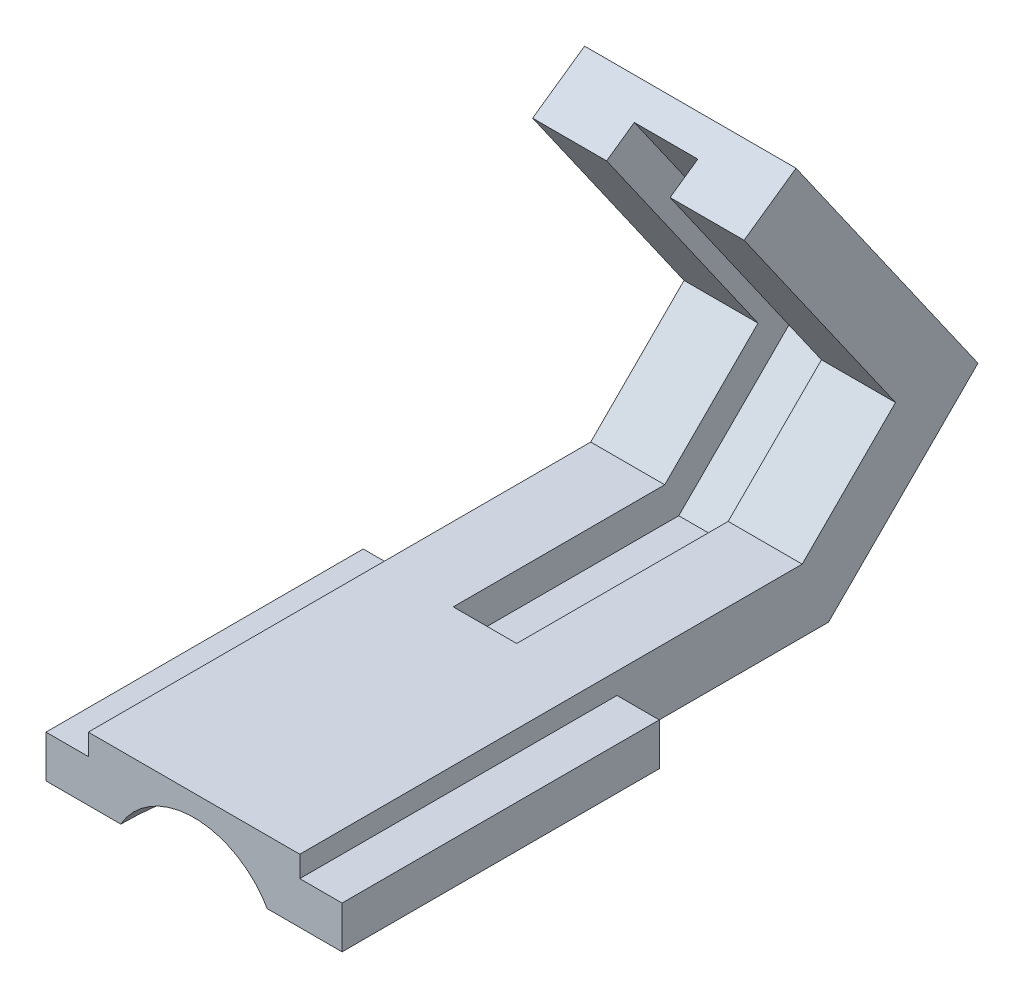
ISO-10303-21;
HEADER;
FILE_DESCRIPTION(('STEP AP214'),'2;1');
FILE_NAME('part.step','',(''),(''),'','','');
FILE_SCHEMA(('AUTOMOTIVE_DESIGN { 1 0 10303 214 1 1 1 1 }'));
ENDSEC;
DATA;
#1=APPLICATION_CONTEXT('core data for automotive mechanical design processes');
#2=APPLICATION_PROTOCOL_DEFINITION('international standard','automotive_design',2000,#1);
#3=PRODUCT_CONTEXT('',#1,'mechanical');
#4=PRODUCT('Part','Part','',(#3));
#5=PRODUCT_RELATED_PRODUCT_CATEGORY('part','',(#4));
#6=PRODUCT_DEFINITION_FORMATION('','',#4);
#7=PRODUCT_DEFINITION_CONTEXT('part definition',#1,'design');
#8=PRODUCT_DEFINITION('design','',#6,#7);
#9=PRODUCT_DEFINITION_SHAPE('','',#8);
#10=(LENGTH_UNIT() NAMED_UNIT(*) SI_UNIT(.MILLI.,.METRE.));
#11=(NAMED_UNIT(*) PLANE_ANGLE_UNIT() SI_UNIT($,.RADIAN.));
#12=(NAMED_UNIT(*) SI_UNIT($,.STERADIAN.) SOLID_ANGLE_UNIT());
#13=UNCERTAINTY_MEASURE_WITH_UNIT(LENGTH_MEASURE(1.E-05),#10,'distance_accuracy_value','');
#14=(GEOMETRIC_REPRESENTATION_CONTEXT(3) GLOBAL_UNCERTAINTY_ASSIGNED_CONTEXT((#13)) GLOBAL_UNIT_ASSIGNED_CONTEXT((#10,
#11,#12)) REPRESENTATION_CONTEXT('',''));
#15=CARTESIAN_POINT('',(0.,0.,0.));
#16=DIRECTION('',(0.,0.,1.));
#17=DIRECTION('',(1.,0.,0.));
#18=AXIS2_PLACEMENT_3D('',#15,#16,#17);
#19=CARTESIAN_POINT('',(25.,0.,0.));
#20=DIRECTION('',(0.,1.,0.));
#21=DIRECTION('',(0.,0.,1.));
#22=AXIS2_PLACEMENT_3D('',#19,#20,#21);
#23=PLANE('',#22);
#24=DIRECTION('',(-1.,0.,0.));
#25=VECTOR('',#24,1.);
#26=CARTESIAN_POINT('',(25.,0.,0.));
#27=LINE('',#26,#25);
#28=CARTESIAN_POINT('',(35.,0.,0.));
#29=VERTEX_POINT('',#28);
#30=CARTESIAN_POINT('',(17.3205080756888,0.,0.));
#31=VERTEX_POINT('',#30);
#32=EDGE_CURVE('E52',#29,#31,#27,.T.);
#33=ORIENTED_EDGE('',*,*,#32,.T.);
#34=CARTESIAN_POINT('',(0.,0.,-37.4165738677395));
#35=CARTESIAN_POINT('',(0.190449586002294,0.,-37.4165765429489));
#36=CARTESIAN_POINT('',(0.38088629959156,0.,-37.4070892532156));
#37=CARTESIAN_POINT('',(0.759898426856213,0.,-37.3695566914317));
#38=CARTESIAN_POINT('',(0.948473929552253,0.,-37.3415123113646));
#39=CARTESIAN_POINT('',(1.3225147561165,0.,-37.2679228624097));
#40=CARTESIAN_POINT('',(1.50797352382135,0.,-37.2223447977661));
#41=CARTESIAN_POINT('',(1.87423352239024,0.,-37.1153165608382));
#42=CARTESIAN_POINT('',(2.05503395561158,0.,-37.0538636899277));
#43=CARTESIAN_POINT('',(2.46840900403924,0.,-36.8949293071889));
#44=CARTESIAN_POINT('',(2.69897054373164,0.,-36.7922149123956));
#45=CARTESIAN_POINT('',(3.15001424466503,0.,-36.5664295897141));
#46=CARTESIAN_POINT('',(3.37048683008799,0.,-36.4433398141302));
#47=CARTESIAN_POINT('',(3.80164460397579,0.,-36.1803301557212));
#48=CARTESIAN_POINT('',(4.01231040446852,0.,-36.040378746188));
#49=CARTESIAN_POINT('',(4.4238394343397,0.,-35.7469405004009));
#50=CARTESIAN_POINT('',(4.62470516416656,0.,-35.5934571451201));
#51=CARTESIAN_POINT('',(5.01045075501212,0.,-35.28095803516));
#52=CARTESIAN_POINT('',(5.19564445780649,0.,-35.1223273691164));
#53=CARTESIAN_POINT('',(5.55826365805222,0.,-34.7963828112377));
#54=CARTESIAN_POINT('',(5.7356875146788,0.,-34.6290671014551));
#55=CARTESIAN_POINT('',(6.08345673908936,0.,-34.2870208175821));
#56=CARTESIAN_POINT('',(6.25379711449714,0.,-34.1122851836024));
#57=CARTESIAN_POINT('',(6.5878344473296,0.,-33.7565609375181));
#58=CARTESIAN_POINT('',(6.75153058478189,0.,-33.575571558704));
#59=CARTESIAN_POINT('',(7.23407910736636,0.,-33.0237809278865));
#60=CARTESIAN_POINT('',(7.54368448989064,0.,-32.6448643008032));
#61=CARTESIAN_POINT('',(8.14129997946339,0.,-31.870742775605));
#62=CARTESIAN_POINT('',(8.42931701812208,0.,-31.4755431693533));
#63=CARTESIAN_POINT('',(9.02227581866135,0.,-30.6201577049662));
#64=CARTESIAN_POINT('',(9.32460683910946,0.,-30.1581658711053));
#65=CARTESIAN_POINT('',(9.90764616479974,0.,-29.2206659853501));
#66=CARTESIAN_POINT('',(10.1883496141302,0.,-28.7451549306837));
#67=CARTESIAN_POINT('',(10.7301694995,0.,-27.7825754702427));
#68=CARTESIAN_POINT('',(10.991268281214,0.,-27.2954971553241));
#69=CARTESIAN_POINT('',(11.4949593872763,0.,-26.3119354084243));
#70=CARTESIAN_POINT('',(11.7375530529136,0.,-25.8154526613583));
#71=CARTESIAN_POINT('',(12.2055917496413,0.,-24.8136936233343));
#72=CARTESIAN_POINT('',(12.4310141150486,0.,-24.3084067556631));
#73=CARTESIAN_POINT('',(12.8651266799921,0.,-23.2907265515917));
#74=CARTESIAN_POINT('',(13.0738167973051,0.,-22.7783331802842));
#75=CARTESIAN_POINT('',(13.6755927495404,0.,-21.2321175685062));
#76=CARTESIAN_POINT('',(14.0445910393508,0.,-20.1888129740029));
#77=CARTESIAN_POINT('',(14.648795796127,0.,-18.3087679498987));
#78=CARTESIAN_POINT('',(14.8957214926381,0.,-17.4757360977947));
#79=CARTESIAN_POINT('',(15.352877320256,0.,-15.7995625969307));
#80=CARTESIAN_POINT('',(15.5631040550165,0.,-14.9564200201709));
#81=CARTESIAN_POINT('',(15.9475960522514,0.,-13.2616198469928));
#82=CARTESIAN_POINT('',(16.1218464817734,0.,-12.4099588895865));
#83=CARTESIAN_POINT('',(16.4347539374086,0.,-10.7000967263963));
#84=CARTESIAN_POINT('',(16.5734074330735,0.,-9.84189488058198));
#85=CARTESIAN_POINT('',(16.9365045132157,0.,-7.2594388241643));
#86=CARTESIAN_POINT('',(17.108057295506,0.,-5.52745573716237));
#87=CARTESIAN_POINT('',(17.3112908198024,0.,-2.05594483378229));
#88=CARTESIAN_POINT('',(17.34300241825,0.,-0.316418766593296));
#89=CARTESIAN_POINT('',(17.2663973525888,0.,3.18225268982277));
#90=CARTESIAN_POINT('',(17.1562508143044,0.,4.94135839477289));
#91=CARTESIAN_POINT('',(16.7918631187944,0.,8.44542857673578));
#92=CARTESIAN_POINT('',(16.5375786023955,0.,10.1903886382134));
#93=CARTESIAN_POINT('',(16.04651428955,0.,12.7862910640336));
#94=CARTESIAN_POINT('',(15.8645783637333,0.,13.6479120421108));
#95=CARTESIAN_POINT('',(15.4636022458473,0.,15.3624456833137));
#96=CARTESIAN_POINT('',(15.2445663335601,0.,16.2153593388798));
#97=CARTESIAN_POINT('',(14.7687699771038,0.,17.910077579059));
#98=CARTESIAN_POINT('',(14.5120311397382,0.,18.7518882274471));
#99=CARTESIAN_POINT('',(13.9596575834222,0.,20.4225512977249));
#100=CARTESIAN_POINT('',(13.6640289214314,0.,21.2514057150591));
#101=CARTESIAN_POINT('',(13.0417327506748,0.,22.868739691321));
#102=CARTESIAN_POINT('',(12.7162714297131,0.,23.657682782976));
#103=CARTESIAN_POINT('',(12.0248710369899,0.,25.2178553180633));
#104=CARTESIAN_POINT('',(11.6589287860132,0.,25.9890833644724));
#105=CARTESIAN_POINT('',(11.077803700784,0.,27.1277078662011));
#106=CARTESIAN_POINT('',(10.8791032062312,0.,27.5035698605903));
#107=CARTESIAN_POINT('',(10.4701830293409,0.,28.248962571091));
#108=CARTESIAN_POINT('',(10.2599642059446,0.,28.6184937566111));
#109=CARTESIAN_POINT('',(9.8273405080962,0.,29.35015552493));
#110=CARTESIAN_POINT('',(9.60494075124292,0.,29.7122891292133));
#111=CARTESIAN_POINT('',(9.14693915734872,0.,30.4280739658928));
#112=CARTESIAN_POINT('',(8.91133911587738,0.,30.7817263426479));
#113=CARTESIAN_POINT('',(8.47414163365244,0.,31.4094093997494));
#114=CARTESIAN_POINT('',(8.27513961700921,0.,31.685247103476));
#115=CARTESIAN_POINT('',(7.86707982274094,0.,32.2293913317087));
#116=CARTESIAN_POINT('',(7.65802241468267,0.,32.4976981324258));
#117=CARTESIAN_POINT('',(7.22824617410527,0.,33.0261527332142));
#118=CARTESIAN_POINT('',(7.00749478689403,0.,33.2862741546901));
#119=CARTESIAN_POINT('',(6.55371377294785,0.,33.79561285362));
#120=CARTESIAN_POINT('',(6.32068458799337,0.,34.0448305228236));
#121=CARTESIAN_POINT('',(5.83792582397416,0.,34.5327946695787));
#122=CARTESIAN_POINT('',(5.58802473108424,0.,34.7713725886317));
#123=CARTESIAN_POINT('',(5.07233849400033,0.,35.2310733070451));
#124=CARTESIAN_POINT('',(4.80654677404185,0.,35.4521887911234));
#125=CARTESIAN_POINT('',(4.25850974883296,0.,35.8707186569807));
#126=CARTESIAN_POINT('',(3.976340157452,0.,36.06823092203));
#127=CARTESIAN_POINT('',(3.3934863809775,0.,36.4332342882637));
#128=CARTESIAN_POINT('',(3.09282638790441,0.,36.6007635405477));
#129=CARTESIAN_POINT('',(2.46256804220275,0.,36.9012662934779));
#130=CARTESIAN_POINT('',(2.13236210924569,0.,37.0330100732722));
#131=CARTESIAN_POINT('',(1.62489740942022,0.,37.1902546050763));
#132=CARTESIAN_POINT('',(1.45378583246705,0.,37.235930945038));
#133=CARTESIAN_POINT('',(1.10824901502559,0.,37.3125818498289));
#134=CARTESIAN_POINT('',(0.933823800846545,0.,37.343556531334));
#135=CARTESIAN_POINT('',(0.581536636406669,0.,37.3899167184373));
#136=CARTESIAN_POINT('',(0.403658581812258,0.,37.4051807099672));
#137=CARTESIAN_POINT('',(0.047252932524218,0.,37.4191372244004));
#138=CARTESIAN_POINT('',(-0.131274638055815,0.,37.4178303563535));
#139=CARTESIAN_POINT('',(-0.487533812481328,0.,37.3986885318112));
#140=CARTESIAN_POINT('',(-0.665264920021886,0.,37.3808444100704));
#141=CARTESIAN_POINT('',(-1.01839965861263,0.,37.3292740715787));
#142=CARTESIAN_POINT('',(-1.19380300959746,0.,37.2955459612333));
#143=CARTESIAN_POINT('',(-1.56896973221064,0.,37.2067318299212));
#144=CARTESIAN_POINT('',(-1.76812752559015,0.,37.1490877226554));
#145=CARTESIAN_POINT('',(-2.16041463018118,0.,37.016173518013));
#146=CARTESIAN_POINT('',(-2.35354265388486,0.,36.9408996850239));
#147=CARTESIAN_POINT('',(-2.92348488457568,0.,36.6919408854932));
#148=CARTESIAN_POINT('',(-3.29033594965717,0.,36.4952529571472));
#149=CARTESIAN_POINT('',(-3.94568211276693,0.,36.089376001188));
#150=CARTESIAN_POINT('',(-4.23789589657269,0.,35.8859562709687));
#151=CARTESIAN_POINT('',(-4.80394090353502,0.,35.4546645001746));
#152=CARTESIAN_POINT('',(-5.07775736336108,0.,35.2267731940191));
#153=CARTESIAN_POINT('',(-5.60927753340579,0.,34.7518688583524));
#154=CARTESIAN_POINT('',(-5.86694051013018,0.,34.504810747299));
#155=CARTESIAN_POINT('',(-6.36728701987999,0.,33.9961727716779));
#156=CARTESIAN_POINT('',(-6.60997413724643,0.,33.7345964106179));
#157=CARTESIAN_POINT('',(-7.1080010886091,0.,33.1703729444409));
#158=CARTESIAN_POINT('',(-7.36180012794719,0.,32.8663715473206));
#159=CARTESIAN_POINT('',(-7.8548796972618,0.,32.2467561015137));
#160=CARTESIAN_POINT('',(-8.09415673349548,0.,31.9311392874666));
#161=CARTESIAN_POINT('',(-8.55977337213487,0.,31.2900881839091));
#162=CARTESIAN_POINT('',(-8.78610080523932,0.,30.9646450850477));
#163=CARTESIAN_POINT('',(-9.2266916863227,0.,30.3057527985463));
#164=CARTESIAN_POINT('',(-9.44095606201352,0.,29.9723042293895));
#165=CARTESIAN_POINT('',(-9.85874193503251,0.,29.2978640119589));
#166=CARTESIAN_POINT('',(-10.0622418777766,0.,28.9568590353243));
#167=CARTESIAN_POINT('',(-10.4587586325066,0.,28.2688273581259));
#168=CARTESIAN_POINT('',(-10.6517753924906,0.,27.9218006277024));
#169=CARTESIAN_POINT('',(-11.2158496045329,0.,26.8730457076604));
#170=CARTESIAN_POINT('',(-11.5721277637326,0.,26.1633217684922));
#171=CARTESIAN_POINT('',(-12.2385382000117,0.,24.7481735160531));
#172=CARTESIAN_POINT('',(-12.5497217241774,0.,24.0432399930483));
#173=CARTESIAN_POINT('',(-13.1401230159853,0.,22.6200058971766));
#174=CARTESIAN_POINT('',(-13.4193359094198,0.,21.9017033054315));
#175=CARTESIAN_POINT('',(-13.9473069980188,0.,20.4535237964603));
#176=CARTESIAN_POINT('',(-14.1960464549253,0.,19.7236400663785));
#177=CARTESIAN_POINT('',(-14.6638858748882,0.,18.2543683747139));
#178=CARTESIAN_POINT('',(-14.8829826915462,0.,17.5149794133112));
#179=CARTESIAN_POINT('',(-15.2921689789977,0.,16.0283810866442));
#180=CARTESIAN_POINT('',(-15.4822642889536,0.,15.2811733280761));
#181=CARTESIAN_POINT('',(-15.8340040492344,0.,13.7800708333632));
#182=CARTESIAN_POINT('',(-15.9956460824846,0.,13.0261755348276));
#183=CARTESIAN_POINT('',(-16.4383228554216,0.,10.7568374418721));
#184=CARTESIAN_POINT('',(-16.6773132439385,0.,9.23299240279795));
#185=CARTESIAN_POINT('',(-17.0532309422777,0.,6.10136013440048));
#186=CARTESIAN_POINT('',(-17.1849219834892,0.,4.49295230911114));
#187=CARTESIAN_POINT('',(-17.3281325517053,0.,1.2705310497917));
#188=CARTESIAN_POINT('',(-17.3396333653463,0.,-0.343483218017196));
#189=CARTESIAN_POINT('',(-17.2424355536434,0.,-3.56919814153638));
#190=CARTESIAN_POINT('',(-17.133639526496,0.,-5.18089586292496));
#191=CARTESIAN_POINT('',(-16.7950607255257,0.,-8.39126001948907));
#192=CARTESIAN_POINT('',(-16.5653036904426,0.,-9.98992915349744));
#193=CARTESIAN_POINT('',(-16.0284676555248,0.,-12.9174668974678));
#194=CARTESIAN_POINT('',(-15.7390140761251,0.,-14.2495624276734));
#195=CARTESIAN_POINT('',(-15.2377209418518,0.,-16.2307587061916));
#196=CARTESIAN_POINT('',(-15.0593942250866,0.,-16.8884663693665));
#197=CARTESIAN_POINT('',(-14.6799489842312,0.,-18.1972571960055));
#198=CARTESIAN_POINT('',(-14.4788320799925,0.,-18.8483408267038));
#199=CARTESIAN_POINT('',(-14.0539896493114,0.,-20.1406652089403));
#200=CARTESIAN_POINT('',(-13.8303425192224,0.,-20.7819317187533));
#201=CARTESIAN_POINT('',(-13.3591818503731,0.,-22.0555837525816));
#202=CARTESIAN_POINT('',(-13.1116707006797,0.,-22.687970158352));
#203=CARTESIAN_POINT('',(-12.5919347231654,0.,-23.9420875054695));
#204=CARTESIAN_POINT('',(-12.3197244411618,0.,-24.5638244652768));
#205=CARTESIAN_POINT('',(-11.7491522194323,0.,-25.795105961332));
#206=CARTESIAN_POINT('',(-11.4507950435068,0.,-26.4046526938103));
#207=CARTESIAN_POINT('',(-10.9322699829784,0.,-27.4042590772426));
#208=CARTESIAN_POINT('',(-10.720031828078,0.,-27.798443196671));
#209=CARTESIAN_POINT('',(-10.2825729995413,0.,-28.5795276986012));
#210=CARTESIAN_POINT('',(-10.0573532351929,0.,-28.9664285887396));
#211=CARTESIAN_POINT('',(-9.59258265066654,0.,-29.7324397927004));
#212=CARTESIAN_POINT('',(-9.35300829667065,0.,-30.1115358638553));
#213=CARTESIAN_POINT('',(-8.85864800452886,0.,-30.8596902148986));
#214=CARTESIAN_POINT('',(-8.60386262309095,0.,-31.2287488614276));
#215=CARTESIAN_POINT('',(-8.07555900294904,0.,-31.9573545689724));
#216=CARTESIAN_POINT('',(-7.80191856592311,0.,-32.3168134923486));
#217=CARTESIAN_POINT('',(-7.23533689677614,0.,-33.0204601145238));
#218=CARTESIAN_POINT('',(-6.94238903356465,0.,-33.3646424979981));
#219=CARTESIAN_POINT('',(-6.33517046984957,0.,-34.0323973475183));
#220=CARTESIAN_POINT('',(-6.02095399420263,0.,-34.3560184293401));
#221=CARTESIAN_POINT('',(-5.53076530158641,0.,-34.8213277480199));
#222=CARTESIAN_POINT('',(-5.36427489476679,0.,-34.9730370170211));
#223=CARTESIAN_POINT('',(-5.02447419777823,0.,-35.2685913750295));
#224=CARTESIAN_POINT('',(-4.85116526543866,0.,-35.4124380162908));
#225=CARTESIAN_POINT('',(-4.5031308586245,0.,-35.6861881474461));
#226=CARTESIAN_POINT('',(-4.32864646583977,0.,-35.8163970131366));
#227=CARTESIAN_POINT('',(-3.97241216190536,0.,-36.0665090699264));
#228=CARTESIAN_POINT('',(-3.79066256108656,0.,-36.1864127005227));
#229=CARTESIAN_POINT('',(-3.4196023309536,0.,-36.4139345814867));
#230=CARTESIAN_POINT('',(-3.23029233169454,0.,-36.5215538527147));
#231=CARTESIAN_POINT('',(-2.84402012566804,0.,-36.722172333963));
#232=CARTESIAN_POINT('',(-2.64705812419182,0.,-36.8151719358687));
#233=CARTESIAN_POINT('',(-2.25277831236942,0.,-36.9809647747379));
#234=CARTESIAN_POINT('',(-2.05571052799125,0.,-37.0543477016034));
#235=CARTESIAN_POINT('',(-1.65563046219459,0.,-37.182501959958));
#236=CARTESIAN_POINT('',(-1.45262047539661,0.,-37.2372803753461));
#237=CARTESIAN_POINT('',(-1.04255237339131,0.,-37.3258737269293));
#238=CARTESIAN_POINT('',(-0.835505554883229,0.,-37.3597403514498));
#239=CARTESIAN_POINT('',(-0.418967039717521,0.,-37.4050871872955));
#240=CARTESIAN_POINT('',(-0.209475733447399,0.,-37.4165709252733));
#241=CARTESIAN_POINT('',(0.,0.,-37.4165738677395));
#242=B_SPLINE_CURVE_WITH_KNOTS('',3,(#34,#35,#36,#37,#38,#39,#40,#41,#42,#43,#44,#45,#46,#47,
#48,#49,#50,#51,#52,#53,#54,#55,#56,#57,#58,#59,#60,#61,#62,#63,#64,#65,#66,#67,#68,#69,#70,#71,
#72,#73,#74,#75,#76,#77,#78,#79,#80,#81,#82,#83,#84,#85,#86,#87,#88,#89,#90,#91,#92,#93,#94,#95,
#96,#97,#98,#99,#100,#101,#102,#103,#104,#105,#106,#107,#108,#109,#110,#111,#112,#113,#114,#115,
#116,#117,#118,#119,#120,#121,#122,#123,#124,#125,#126,#127,#128,#129,#130,#131,#132,#133,#134,
#135,#136,#137,#138,#139,#140,#141,#142,#143,#144,#145,#146,#147,#148,#149,#150,#151,#152,#153,
#154,#155,#156,#157,#158,#159,#160,#161,#162,#163,#164,#165,#166,#167,#168,#169,#170,#171,#172,
#173,#174,#175,#176,#177,#178,#179,#180,#181,#182,#183,#184,#185,#186,#187,#188,#189,#190,#191,
#192,#193,#194,#195,#196,#197,#198,#199,#200,#201,#202,#203,#204,#205,#206,#207,#208,#209,#210,
#211,#212,#213,#214,#215,#216,#217,#218,#219,#220,#221,#222,#223,#224,#225,#226,#227,#228,#229,
#230,#231,#232,#233,#234,#235,#236,#237,#238,#239,#240,#241),.UNSPECIFIED.,.T.,.F.,(4,2,2,2,2,2,
2,2,2,2,2,2,2,2,2,2,2,2,2,2,2,2,2,2,2,2,2,2,2,2,2,2,2,2,2,2,2,2,2,2,2,2,2,2,2,2,2,2,2,2,2,2,2,2,
2,2,2,2,2,2,2,2,2,2,2,2,2,2,2,2,2,2,2,2,2,2,2,2,2,2,2,2,2,2,2,2,2,2,2,2,2,2,2,2,2,2,2,2,2,2,2,2,
2,4),(0.,0.571096123312307,1.14216479774811,1.71431343647763,2.28655940127964,3.04252061835114,
3.79918506520186,4.55728689048577,5.31519426663181,6.04641513183485,6.77778967780181,
7.50967124364974,8.2416428588363,9.7085795543758,11.1750432084417,12.8307097834001,
14.4867470186966,16.1442580890604,17.8016489052133,19.4611908312382,21.1207409118301,
24.4383664729071,27.0441702585168,29.6502150734369,32.2573322186982,34.8647078339598,
40.0798319951767,45.2938053635841,50.5757139136338,55.8592121961228,58.5004012867574,
61.1412859022229,63.7806629424683,66.4196293942162,68.978942809877,71.5384573669798,
72.813749747406,74.0889471562319,75.3636128633732,76.6381056029997,77.6582945137954,
78.6784459580998,79.701604189554,80.7247256307755,81.7605581011011,82.7968222208474,
83.8286276973457,84.8591107983232,85.9214814711193,86.4522518331624,86.9830179828153,
87.517859168823,88.0526806971882,88.5877988106991,89.1229807339647,89.7440078516779,
90.365166679833,91.6090789485909,92.6758444901896,93.7434561014807,94.8136597231805,
95.8836061995007,97.0711437584008,98.2589658949291,99.4478865399836,100.636715625603,
101.827841485317,103.018973253075,105.400108907613,107.711001569088,110.022246078959,
112.334904725633,114.647808655657,116.960246289355,119.272880267406,123.895821435131,
128.732746215769,133.570424084124,138.412021787925,143.252589686427,147.338944487924,
149.3829620915,151.426834504045,153.463825784775,155.500613350235,157.536209100808,
159.571434746563,160.91429214224,162.257055592415,163.602084115846,164.947063442758,
166.301773954129,167.656952186975,169.008796807954,169.684336582684,170.35974250583,
171.012567390947,171.665364420604,172.318107161677,172.970832402763,173.600883916443,
174.230695260519,174.8589435826,175.487092909731),.UNSPECIFIED.);
#243=CARTESIAN_POINT('',(-17.3205080756888,0.,0.));
#244=VERTEX_POINT('',#243);
#245=EDGE_CURVE('E11',#244,#31,#242,.T.);
#246=ORIENTED_EDGE('',*,*,#245,.F.);
#247=CARTESIAN_POINT('',(-35.,0.,0.));
#248=VERTEX_POINT('',#247);
#249=EDGE_CURVE('E205',#244,#248,#27,.T.);
#250=ORIENTED_EDGE('',*,*,#249,.T.);
#251=DIRECTION('',(0.,0.,1.));
#252=VECTOR('',#251,1.);
#253=CARTESIAN_POINT('',(-35.,0.,0.));
#254=LINE('',#253,#252);
#255=CARTESIAN_POINT('',(-35.,0.,-75.));
#256=VERTEX_POINT('',#255);
#257=EDGE_CURVE('E387',#256,#248,#254,.T.);
#258=ORIENTED_EDGE('',*,*,#257,.F.);
#259=DIRECTION('',(-1.,0.,0.));
#260=VECTOR('',#259,1.);
#261=CARTESIAN_POINT('',(-25.,0.,-75.));
#262=LINE('',#261,#260);
#263=CARTESIAN_POINT('',(-25.,0.,-75.));
#264=VERTEX_POINT('',#263);
#265=EDGE_CURVE('E392',#264,#256,#262,.T.);
#266=ORIENTED_EDGE('',*,*,#265,.F.);
#267=DIRECTION('',(0.,0.,-1.));
#268=VECTOR('',#267,1.);
#269=CARTESIAN_POINT('',(-25.,0.,0.));
#270=LINE('',#269,#268);
#271=CARTESIAN_POINT('',(-25.,0.,-125.));
#272=VERTEX_POINT('',#271);
#273=EDGE_CURVE('E267',#264,#272,#270,.T.);
#274=ORIENTED_EDGE('',*,*,#273,.T.);
#275=DIRECTION('',(-1.,0.,0.));
#276=VECTOR('',#275,1.);
#277=CARTESIAN_POINT('',(25.,0.,-125.));
#278=LINE('',#277,#276);
#279=CARTESIAN_POINT('',(25.,0.,-125.));
#280=VERTEX_POINT('',#279);
#281=EDGE_CURVE('E212',#280,#272,#278,.T.);
#282=ORIENTED_EDGE('',*,*,#281,.F.);
#283=DIRECTION('',(0.,0.,-1.));
#284=VECTOR('',#283,1.);
#285=CARTESIAN_POINT('',(25.,0.,0.));
#286=LINE('',#285,#284);
#287=CARTESIAN_POINT('',(25.,0.,-75.));
#288=VERTEX_POINT('',#287);
#289=EDGE_CURVE('E292',#288,#280,#286,.T.);
#290=ORIENTED_EDGE('',*,*,#289,.F.);
#291=DIRECTION('',(-1.,0.,0.));
#292=VECTOR('',#291,1.);
#293=CARTESIAN_POINT('',(25.,0.,-75.));
#294=LINE('',#293,#292);
#295=CARTESIAN_POINT('',(35.,0.,-75.));
#296=VERTEX_POINT('',#295);
#297=EDGE_CURVE('E65',#296,#288,#294,.T.);
#298=ORIENTED_EDGE('',*,*,#297,.F.);
#299=DIRECTION('',(0.,0.,-1.));
#300=VECTOR('',#299,1.);
#301=CARTESIAN_POINT('',(35.,0.,0.));
#302=LINE('',#301,#300);
#303=EDGE_CURVE('E207',#29,#296,#302,.T.);
#304=ORIENTED_EDGE('',*,*,#303,.F.);
#305=EDGE_LOOP('',(#33,#246,#250,#258,#266,#274,#282,#290,#298,#304));
#306=FACE_BOUND('',#305,.T.);
#307=ADVANCED_FACE('F39',(#306),#23,.F.);
#308=CARTESIAN_POINT('',(-25.,0.,0.));
#309=DIRECTION('',(1.,0.,0.));
#310=DIRECTION('',(0.,0.,-1.));
#311=AXIS2_PLACEMENT_3D('',#308,#309,#310);
#312=PLANE('',#311);
#313=DIRECTION('',(0.,-1.,0.));
#314=VECTOR('',#313,1.);
#315=CARTESIAN_POINT('',(-25.,10.,-75.));
#316=LINE('',#315,#314);
#317=CARTESIAN_POINT('',(-25.,10.,-75.));
#318=VERTEX_POINT('',#317);
#319=EDGE_CURVE('E348',#318,#264,#316,.T.);
#320=ORIENTED_EDGE('',*,*,#319,.F.);
#321=DIRECTION('',(0.,0.,-1.));
#322=VECTOR('',#321,1.);
#323=CARTESIAN_POINT('',(-25.,10.,0.));
#324=LINE('',#323,#322);
#325=CARTESIAN_POINT('',(-25.,10.,0.));
#326=VERTEX_POINT('',#325);
#327=EDGE_CURVE('E391',#326,#318,#324,.T.);
#328=ORIENTED_EDGE('',*,*,#327,.F.);
#329=DIRECTION('',(0.,-1.,0.));
#330=VECTOR('',#329,1.);
#331=CARTESIAN_POINT('',(-25.,15.,0.));
#332=LINE('',#331,#330);
#333=CARTESIAN_POINT('',(-25.,15.,0.));
#334=VERTEX_POINT('',#333);
#335=EDGE_CURVE('E270',#334,#326,#332,.T.);
#336=ORIENTED_EDGE('',*,*,#335,.F.);
#337=DIRECTION('',(0.,0.,1.));
#338=VECTOR('',#337,1.);
#339=CARTESIAN_POINT('',(-25.,15.,-118.786796564404));
#340=LINE('',#339,#338);
#341=CARTESIAN_POINT('',(-25.,15.,-118.786796564404));
#342=VERTEX_POINT('',#341);
#343=EDGE_CURVE('E245',#342,#334,#340,.T.);
#344=ORIENTED_EDGE('',*,*,#343,.F.);
#345=DIRECTION('',(0.,-0.707106781186549,0.707106781186546));
#346=VECTOR('',#345,1.);
#347=CARTESIAN_POINT('',(-25.,37.0619451876768,-140.84874175208));
#348=LINE('',#347,#346);
#349=CARTESIAN_POINT('',(-25.,37.0619451876768,-140.84874175208));
#350=VERTEX_POINT('',#349);
#351=EDGE_CURVE('E249',#350,#342,#348,.T.);
#352=ORIENTED_EDGE('',*,*,#351,.F.);
#353=DIRECTION('',(0.,-0.819152044288989,-0.57357643635105));
#354=VECTOR('',#353,1.);
#355=CARTESIAN_POINT('',(-25.,88.1880958357359,-105.049825668664));
#356=LINE('',#355,#354);
#357=CARTESIAN_POINT('',(-25.,88.1880958357359,-105.049825668664));
#358=VERTEX_POINT('',#357);
#359=EDGE_CURVE('E253',#358,#350,#356,.T.);
#360=ORIENTED_EDGE('',*,*,#359,.F.);
#361=DIRECTION('',(0.,-0.57357643635105,0.819152044288989));
#362=VECTOR('',#361,1.);
#363=CARTESIAN_POINT('',(-25.,96.7917423810016,-117.337106332999));
#364=LINE('',#363,#362);
#365=CARTESIAN_POINT('',(-25.,96.7917423810016,-117.337106332999));
#366=VERTEX_POINT('',#365);
#367=EDGE_CURVE('E257',#366,#358,#364,.T.);
#368=ORIENTED_EDGE('',*,*,#367,.F.);
#369=DIRECTION('',(0.,0.819152044288989,0.57357643635105));
#370=VECTOR('',#369,1.);
#371=CARTESIAN_POINT('',(-25.,35.3553390593274,-160.355339059327));
#372=LINE('',#371,#370);
#373=CARTESIAN_POINT('',(-25.,35.3553390593274,-160.355339059327));
#374=VERTEX_POINT('',#373);
#375=EDGE_CURVE('E261',#374,#366,#372,.T.);
#376=ORIENTED_EDGE('',*,*,#375,.F.);
#377=DIRECTION('',(0.,0.707106781186548,-0.707106781186547));
#378=VECTOR('',#377,1.);
#379=CARTESIAN_POINT('',(-25.,0.,-125.));
#380=LINE('',#379,#378);
#381=EDGE_CURVE('E264',#272,#374,#380,.T.);
#382=ORIENTED_EDGE('',*,*,#381,.F.);
#383=ORIENTED_EDGE('',*,*,#273,.F.);
#384=EDGE_LOOP('',(#320,#328,#336,#344,#352,#360,#368,#376,#382,#383));
#385=FACE_BOUND('',#384,.T.);
#386=ADVANCED_FACE('F482',(#385),#312,.F.);
#387=CARTESIAN_POINT('',(25.,88.1880958357359,-105.049825668664));
#388=DIRECTION('',(0.,0.57357643635105,-0.819152044288989));
#389=DIRECTION('',(0.,0.819152044288989,0.57357643635105));
#390=AXIS2_PLACEMENT_3D('',#387,#388,#389);
#391=PLANE('',#390);
#392=DIRECTION('',(0.,-0.819152044288989,-0.57357643635105));
#393=VECTOR('',#392,1.);
#394=CARTESIAN_POINT('',(7.5,37.0619451876768,-140.84874175208));
#395=LINE('',#394,#393);
#396=CARTESIAN_POINT('',(7.5,88.1880958357359,-105.049825668664));
#397=VERTEX_POINT('',#396);
#398=CARTESIAN_POINT('',(7.5,37.0619451876768,-140.84874175208));
#399=VERTEX_POINT('',#398);
#400=EDGE_CURVE('E340',#397,#399,#395,.T.);
#401=ORIENTED_EDGE('',*,*,#400,.T.);
#402=DIRECTION('',(-1.,0.,0.));
#403=VECTOR('',#402,1.);
#404=CARTESIAN_POINT('',(25.,37.0619451876768,-140.84874175208));
#405=LINE('',#404,#403);
#406=CARTESIAN_POINT('',(25.,37.0619451876768,-140.84874175208));
#407=VERTEX_POINT('',#406);
#408=EDGE_CURVE('E230',#407,#399,#405,.T.);
#409=ORIENTED_EDGE('',*,*,#408,.F.);
#410=DIRECTION('',(0.,-0.819152044288989,-0.57357643635105));
#411=VECTOR('',#410,1.);
#412=CARTESIAN_POINT('',(25.,88.1880958357359,-105.049825668664));
#413=LINE('',#412,#411);
#414=CARTESIAN_POINT('',(25.,88.1880958357359,-105.049825668664));
#415=VERTEX_POINT('',#414);
#416=EDGE_CURVE('E280',#415,#407,#413,.T.);
#417=ORIENTED_EDGE('',*,*,#416,.F.);
#418=DIRECTION('',(-1.,0.,0.));
#419=VECTOR('',#418,1.);
#420=CARTESIAN_POINT('',(25.,88.1880958357359,-105.049825668664));
#421=LINE('',#420,#419);
#422=EDGE_CURVE('E225',#415,#397,#421,.T.);
#423=ORIENTED_EDGE('',*,*,#422,.T.);
#424=EDGE_LOOP('',(#401,#409,#417,#423));
#425=FACE_BOUND('',#424,.T.);
#426=ADVANCED_FACE('F469',(#425),#391,.F.);
#427=CARTESIAN_POINT('',(25.,37.0619451876768,-140.84874175208));
#428=DIRECTION('',(0.,-0.707106781186546,-0.707106781186549));
#429=DIRECTION('',(0.,0.707106781186549,-0.707106781186546));
#430=AXIS2_PLACEMENT_3D('',#427,#428,#429);
#431=PLANE('',#430);
#432=DIRECTION('',(0.,-0.707106781186549,0.707106781186546));
#433=VECTOR('',#432,1.);
#434=CARTESIAN_POINT('',(7.5,15.,-118.786796564404));
#435=LINE('',#434,#433);
#436=CARTESIAN_POINT('',(7.5,15.,-118.786796564404));
#437=VERTEX_POINT('',#436);
#438=EDGE_CURVE('E336',#399,#437,#435,.T.);
#439=ORIENTED_EDGE('',*,*,#438,.T.);
#440=DIRECTION('',(-1.,0.,0.));
#441=VECTOR('',#440,1.);
#442=CARTESIAN_POINT('',(25.,15.,-118.786796564404));
#443=LINE('',#442,#441);
#444=CARTESIAN_POINT('',(25.,15.,-118.786796564404));
#445=VERTEX_POINT('',#444);
#446=EDGE_CURVE('E235',#445,#437,#443,.T.);
#447=ORIENTED_EDGE('',*,*,#446,.F.);
#448=DIRECTION('',(0.,-0.707106781186549,0.707106781186546));
#449=VECTOR('',#448,1.);
#450=CARTESIAN_POINT('',(25.,37.0619451876768,-140.84874175208));
#451=LINE('',#450,#449);
#452=EDGE_CURVE('E277',#407,#445,#451,.T.);
#453=ORIENTED_EDGE('',*,*,#452,.F.);
#454=ORIENTED_EDGE('',*,*,#408,.T.);
#455=EDGE_LOOP('',(#439,#447,#453,#454));
#456=FACE_BOUND('',#455,.T.);
#457=ADVANCED_FACE('F473',(#456),#431,.F.);
#458=CARTESIAN_POINT('',(25.,15.,0.));
#459=DIRECTION('',(0.,0.,-1.));
#460=DIRECTION('',(-1.,0.,0.));
#461=AXIS2_PLACEMENT_3D('',#458,#459,#460);
#462=PLANE('',#461);
#463=CARTESIAN_POINT('',(0.,-10.,0.));
#464=DIRECTION('',(0.,0.,1.));
#465=DIRECTION('',(1.,0.,0.));
#466=AXIS2_PLACEMENT_3D('',#463,#464,#465);
#467=CIRCLE('',#466,20.);
#468=EDGE_CURVE('E57',#31,#244,#467,.T.);
#469=ORIENTED_EDGE('',*,*,#468,.F.);
#470=ORIENTED_EDGE('',*,*,#32,.F.);
#471=DIRECTION('',(0.,-1.,0.));
#472=VECTOR('',#471,1.);
#473=CARTESIAN_POINT('',(35.,10.,0.));
#474=LINE('',#473,#472);
#475=CARTESIAN_POINT('',(35.,10.,0.));
#476=VERTEX_POINT('',#475);
#477=EDGE_CURVE('E395',#476,#29,#474,.T.);
#478=ORIENTED_EDGE('',*,*,#477,.F.);
#479=DIRECTION('',(1.,0.,0.));
#480=VECTOR('',#479,1.);
#481=CARTESIAN_POINT('',(25.,10.,0.));
#482=LINE('',#481,#480);
#483=CARTESIAN_POINT('',(25.,10.,0.));
#484=VERTEX_POINT('',#483);
#485=EDGE_CURVE('E427',#484,#476,#482,.T.);
#486=ORIENTED_EDGE('',*,*,#485,.F.);
#487=DIRECTION('',(0.,-1.,0.));
#488=VECTOR('',#487,1.);
#489=CARTESIAN_POINT('',(25.,15.,0.));
#490=LINE('',#489,#488);
#491=CARTESIAN_POINT('',(25.,15.,0.));
#492=VERTEX_POINT('',#491);
#493=EDGE_CURVE('E248',#492,#484,#490,.T.);
#494=ORIENTED_EDGE('',*,*,#493,.F.);
#495=DIRECTION('',(-1.,0.,0.));
#496=VECTOR('',#495,1.);
#497=CARTESIAN_POINT('',(25.,15.,0.));
#498=LINE('',#497,#496);
#499=EDGE_CURVE('E240',#492,#334,#498,.T.);
#500=ORIENTED_EDGE('',*,*,#499,.T.);
#501=ORIENTED_EDGE('',*,*,#335,.T.);
#502=DIRECTION('',(1.,0.,0.));
#503=VECTOR('',#502,1.);
#504=CARTESIAN_POINT('',(-25.,10.,0.));
#505=LINE('',#504,#503);
#506=CARTESIAN_POINT('',(-35.,10.,0.));
#507=VERTEX_POINT('',#506);
#508=EDGE_CURVE('E386',#507,#326,#505,.T.);
#509=ORIENTED_EDGE('',*,*,#508,.F.);
#510=DIRECTION('',(0.,-1.,0.));
#511=VECTOR('',#510,1.);
#512=CARTESIAN_POINT('',(-35.,10.,0.));
#513=LINE('',#512,#511);
#514=EDGE_CURVE('E383',#507,#248,#513,.T.);
#515=ORIENTED_EDGE('',*,*,#514,.T.);
#516=ORIENTED_EDGE('',*,*,#249,.F.);
#517=EDGE_LOOP('',(#469,#470,#478,#486,#494,#500,#501,#509,#515,#516));
#518=FACE_BOUND('',#517,.T.);
#519=ADVANCED_FACE('F41',(#518),#462,.F.);
#520=CARTESIAN_POINT('',(25.,0.,-125.));
#521=DIRECTION('',(0.,0.707106781186547,0.707106781186548));
#522=DIRECTION('',(0.,-0.707106781186548,0.707106781186547));
#523=AXIS2_PLACEMENT_3D('',#520,#521,#522);
#524=PLANE('',#523);
#525=ORIENTED_EDGE('',*,*,#381,.T.);
#526=DIRECTION('',(-1.,0.,0.));
#527=VECTOR('',#526,1.);
#528=CARTESIAN_POINT('',(25.,35.3553390593274,-160.355339059327));
#529=LINE('',#528,#527);
#530=CARTESIAN_POINT('',(25.,35.3553390593274,-160.355339059327));
#531=VERTEX_POINT('',#530);
#532=EDGE_CURVE('E217',#531,#374,#529,.T.);
#533=ORIENTED_EDGE('',*,*,#532,.F.);
#534=DIRECTION('',(0.,0.707106781186548,-0.707106781186547));
#535=VECTOR('',#534,1.);
#536=CARTESIAN_POINT('',(25.,0.,-125.));
#537=LINE('',#536,#535);
#538=EDGE_CURVE('E289',#280,#531,#537,.T.);
#539=ORIENTED_EDGE('',*,*,#538,.F.);
#540=ORIENTED_EDGE('',*,*,#281,.T.);
#541=EDGE_LOOP('',(#525,#533,#539,#540));
#542=FACE_BOUND('',#541,.T.);
#543=ADVANCED_FACE('F454',(#542),#524,.F.);
#544=CARTESIAN_POINT('',(25.,35.3553390593274,-160.355339059327));
#545=DIRECTION('',(0.,-0.57357643635105,0.819152044288989));
#546=DIRECTION('',(0.,-0.819152044288989,-0.57357643635105));
#547=AXIS2_PLACEMENT_3D('',#544,#545,#546);
#548=PLANE('',#547);
#549=ORIENTED_EDGE('',*,*,#375,.T.);
#550=DIRECTION('',(-1.,0.,0.));
#551=VECTOR('',#550,1.);
#552=CARTESIAN_POINT('',(25.,96.7917423810016,-117.337106332999));
#553=LINE('',#552,#551);
#554=CARTESIAN_POINT('',(25.,96.7917423810016,-117.337106332999));
#555=VERTEX_POINT('',#554);
#556=EDGE_CURVE('E221',#555,#366,#553,.T.);
#557=ORIENTED_EDGE('',*,*,#556,.F.);
#558=DIRECTION('',(0.,0.819152044288989,0.57357643635105));
#559=VECTOR('',#558,1.);
#560=CARTESIAN_POINT('',(25.,35.3553390593274,-160.355339059327));
#561=LINE('',#560,#559);
#562=EDGE_CURVE('E286',#531,#555,#561,.T.);
#563=ORIENTED_EDGE('',*,*,#562,.F.);
#564=ORIENTED_EDGE('',*,*,#532,.T.);
#565=EDGE_LOOP('',(#549,#557,#563,#564));
#566=FACE_BOUND('',#565,.T.);
#567=ADVANCED_FACE('F460',(#566),#548,.F.);
#568=CARTESIAN_POINT('',(25.,96.7917423810016,-117.337106332999));
#569=DIRECTION('',(0.,-0.819152044288989,-0.57357643635105));
#570=DIRECTION('',(0.,0.57357643635105,-0.819152044288989));
#571=AXIS2_PLACEMENT_3D('',#568,#569,#570);
#572=PLANE('',#571);
#573=CARTESIAN_POINT('',(-7.5,88.1880958357359,-105.049825668664));
#574=VERTEX_POINT('',#573);
#575=EDGE_CURVE('E229',#574,#358,#421,.T.);
#576=ORIENTED_EDGE('',*,*,#575,.F.);
#577=DIRECTION('',(0.,-0.573576436351049,0.81915204428899));
#578=VECTOR('',#577,1.);
#579=CARTESIAN_POINT('',(-7.5,88.1880958357359,-105.049825668664));
#580=LINE('',#579,#578);
#581=CARTESIAN_POINT('',(-7.5,92.7767073265443,-111.603042022976));
#582=VERTEX_POINT('',#581);
#583=EDGE_CURVE('E319',#582,#574,#580,.T.);
#584=ORIENTED_EDGE('',*,*,#583,.F.);
#585=DIRECTION('',(1.,0.,0.));
#586=VECTOR('',#585,1.);
#587=CARTESIAN_POINT('',(-7.5,92.7767073265443,-111.603042022976));
#588=LINE('',#587,#586);
#589=CARTESIAN_POINT('',(7.5,92.7767073265443,-111.603042022976));
#590=VERTEX_POINT('',#589);
#591=EDGE_CURVE('E274',#582,#590,#588,.T.);
#592=ORIENTED_EDGE('',*,*,#591,.T.);
#593=DIRECTION('',(0.,-0.573576436351049,0.81915204428899));
#594=VECTOR('',#593,1.);
#595=CARTESIAN_POINT('',(7.5,88.1880958357359,-105.049825668664));
#596=LINE('',#595,#594);
#597=EDGE_CURVE('E344',#590,#397,#596,.T.);
#598=ORIENTED_EDGE('',*,*,#597,.T.);
#599=ORIENTED_EDGE('',*,*,#422,.F.);
#600=DIRECTION('',(0.,-0.57357643635105,0.819152044288989));
#601=VECTOR('',#600,1.);
#602=CARTESIAN_POINT('',(25.,96.7917423810016,-117.337106332999));
#603=LINE('',#602,#601);
#604=EDGE_CURVE('E283',#555,#415,#603,.T.);
#605=ORIENTED_EDGE('',*,*,#604,.F.);
#606=ORIENTED_EDGE('',*,*,#556,.T.);
#607=ORIENTED_EDGE('',*,*,#367,.T.);
#608=EDGE_LOOP('',(#576,#584,#592,#598,#599,#605,#606,#607));
#609=FACE_BOUND('',#608,.T.);
#610=ADVANCED_FACE('F465',(#609),#572,.F.);
#611=CARTESIAN_POINT('',(-7.5,37.0619451876768,-140.84874175208));
#612=VERTEX_POINT('',#611);
#613=EDGE_CURVE('E234',#612,#350,#405,.T.);
#614=ORIENTED_EDGE('',*,*,#613,.F.);
#615=DIRECTION('',(0.,-0.819152044288989,-0.57357643635105));
#616=VECTOR('',#615,1.);
#617=CARTESIAN_POINT('',(-7.5,37.0619451876768,-140.84874175208));
#618=LINE('',#617,#616);
#619=EDGE_CURVE('E371',#574,#612,#618,.T.);
#620=ORIENTED_EDGE('',*,*,#619,.F.);
#621=ORIENTED_EDGE('',*,*,#575,.T.);
#622=ORIENTED_EDGE('',*,*,#359,.T.);
#623=EDGE_LOOP('',(#614,#620,#621,#622));
#624=FACE_BOUND('',#623,.T.);
#625=ADVANCED_FACE('F506',(#624),#391,.F.);
#626=CARTESIAN_POINT('',(-7.5,15.,-118.786796564404));
#627=VERTEX_POINT('',#626);
#628=EDGE_CURVE('E239',#627,#342,#443,.T.);
#629=ORIENTED_EDGE('',*,*,#628,.F.);
#630=DIRECTION('',(0.,-0.707106781186549,0.707106781186546));
#631=VECTOR('',#630,1.);
#632=CARTESIAN_POINT('',(-7.5,15.,-118.786796564404));
#633=LINE('',#632,#631);
#634=EDGE_CURVE('E368',#612,#627,#633,.T.);
#635=ORIENTED_EDGE('',*,*,#634,.F.);
#636=ORIENTED_EDGE('',*,*,#613,.T.);
#637=ORIENTED_EDGE('',*,*,#351,.T.);
#638=EDGE_LOOP('',(#629,#635,#636,#637));
#639=FACE_BOUND('',#638,.T.);
#640=ADVANCED_FACE('F505',(#639),#431,.F.);
#641=CARTESIAN_POINT('',(25.,15.,-118.786796564404));
#642=DIRECTION('',(0.,-1.,0.));
#643=DIRECTION('',(0.,0.,-1.));
#644=AXIS2_PLACEMENT_3D('',#641,#642,#643);
#645=PLANE('',#644);
#646=DIRECTION('',(1.,0.,0.));
#647=VECTOR('',#646,1.);
#648=CARTESIAN_POINT('',(-7.5,15.,-68.7867965644036));
#649=LINE('',#648,#647);
#650=CARTESIAN_POINT('',(-7.5,15.,-68.7867965644036));
#651=VERTEX_POINT('',#650);
#652=CARTESIAN_POINT('',(7.5,15.,-68.7867965644036));
#653=VERTEX_POINT('',#652);
#654=EDGE_CURVE('E298',#651,#653,#649,.T.);
#655=ORIENTED_EDGE('',*,*,#654,.F.);
#656=DIRECTION('',(0.,0.,1.));
#657=VECTOR('',#656,1.);
#658=CARTESIAN_POINT('',(-7.5,15.,-68.7867965644036));
#659=LINE('',#658,#657);
#660=EDGE_CURVE('E364',#627,#651,#659,.T.);
#661=ORIENTED_EDGE('',*,*,#660,.F.);
#662=ORIENTED_EDGE('',*,*,#628,.T.);
#663=ORIENTED_EDGE('',*,*,#343,.T.);
#664=ORIENTED_EDGE('',*,*,#499,.F.);
#665=DIRECTION('',(0.,0.,1.));
#666=VECTOR('',#665,1.);
#667=CARTESIAN_POINT('',(25.,15.,-118.786796564404));
#668=LINE('',#667,#666);
#669=EDGE_CURVE('E244',#445,#492,#668,.T.);
#670=ORIENTED_EDGE('',*,*,#669,.F.);
#671=ORIENTED_EDGE('',*,*,#446,.T.);
#672=DIRECTION('',(0.,0.,1.));
#673=VECTOR('',#672,1.);
#674=CARTESIAN_POINT('',(7.5,15.,-68.7867965644036));
#675=LINE('',#674,#673);
#676=EDGE_CURVE('E332',#437,#653,#675,.T.);
#677=ORIENTED_EDGE('',*,*,#676,.T.);
#678=EDGE_LOOP('',(#655,#661,#662,#663,#664,#670,#671,#677));
#679=FACE_BOUND('',#678,.T.);
#680=ADVANCED_FACE('F476',(#679),#645,.F.);
#681=CARTESIAN_POINT('',(25.,0.,0.));
#682=DIRECTION('',(1.,0.,0.));
#683=DIRECTION('',(0.,0.,-1.));
#684=AXIS2_PLACEMENT_3D('',#681,#682,#683);
#685=PLANE('',#684);
#686=DIRECTION('',(0.,0.,1.));
#687=VECTOR('',#686,1.);
#688=CARTESIAN_POINT('',(25.,10.,0.));
#689=LINE('',#688,#687);
#690=CARTESIAN_POINT('',(25.,10.,-75.));
#691=VERTEX_POINT('',#690);
#692=EDGE_CURVE('E419',#691,#484,#689,.T.);
#693=ORIENTED_EDGE('',*,*,#692,.F.);
#694=DIRECTION('',(0.,-1.,0.));
#695=VECTOR('',#694,1.);
#696=CARTESIAN_POINT('',(25.,10.,-75.));
#697=LINE('',#696,#695);
#698=EDGE_CURVE('E413',#691,#288,#697,.T.);
#699=ORIENTED_EDGE('',*,*,#698,.T.);
#700=ORIENTED_EDGE('',*,*,#289,.T.);
#701=ORIENTED_EDGE('',*,*,#538,.T.);
#702=ORIENTED_EDGE('',*,*,#562,.T.);
#703=ORIENTED_EDGE('',*,*,#604,.T.);
#704=ORIENTED_EDGE('',*,*,#416,.T.);
#705=ORIENTED_EDGE('',*,*,#452,.T.);
#706=ORIENTED_EDGE('',*,*,#669,.T.);
#707=ORIENTED_EDGE('',*,*,#493,.T.);
#708=EDGE_LOOP('',(#693,#699,#700,#701,#702,#703,#704,#705,#706,#707));
#709=FACE_BOUND('',#708,.T.);
#710=ADVANCED_FACE('F438',(#709),#685,.T.);
#711=CARTESIAN_POINT('',(-7.5,92.7767073265443,-111.603042022976));
#712=DIRECTION('',(0.,0.57357643635105,-0.819152044288989));
#713=DIRECTION('',(0.,0.819152044288989,0.57357643635105));
#714=AXIS2_PLACEMENT_3D('',#711,#712,#713);
#715=PLANE('',#714);
#716=DIRECTION('',(0.,0.819152044288989,0.57357643635105));
#717=VECTOR('',#716,1.);
#718=CARTESIAN_POINT('',(7.5,92.7767073265443,-111.603042022976));
#719=LINE('',#718,#717);
#720=CARTESIAN_POINT('',(7.5,36.1517552525572,-151.252260315945));
#721=VERTEX_POINT('',#720);
#722=EDGE_CURVE('E315',#721,#590,#719,.T.);
#723=ORIENTED_EDGE('',*,*,#722,.T.);
#724=ORIENTED_EDGE('',*,*,#591,.F.);
#725=DIRECTION('',(0.,0.819152044288989,0.57357643635105));
#726=VECTOR('',#725,1.);
#727=CARTESIAN_POINT('',(-7.5,92.7767073265443,-111.603042022976));
#728=LINE('',#727,#726);
#729=CARTESIAN_POINT('',(-7.5,36.1517552525572,-151.252260315945));
#730=VERTEX_POINT('',#729);
#731=EDGE_CURVE('E303',#730,#582,#728,.T.);
#732=ORIENTED_EDGE('',*,*,#731,.F.);
#733=DIRECTION('',(1.,0.,0.));
#734=VECTOR('',#733,1.);
#735=CARTESIAN_POINT('',(-7.5,36.1517552525572,-151.252260315945));
#736=LINE('',#735,#734);
#737=EDGE_CURVE('E309',#730,#721,#736,.T.);
#738=ORIENTED_EDGE('',*,*,#737,.T.);
#739=EDGE_LOOP('',(#723,#724,#732,#738));
#740=FACE_BOUND('',#739,.T.);
#741=ADVANCED_FACE('F565',(#740),#715,.F.);
#742=CARTESIAN_POINT('',(-7.5,36.1517552525572,-151.252260315945));
#743=DIRECTION('',(0.,-0.707106781186546,-0.707106781186549));
#744=DIRECTION('',(0.,0.707106781186549,-0.707106781186546));
#745=AXIS2_PLACEMENT_3D('',#742,#743,#744);
#746=PLANE('',#745);
#747=DIRECTION('',(0.,0.707106781186549,-0.707106781186546));
#748=VECTOR('',#747,1.);
#749=CARTESIAN_POINT('',(7.5,36.1517552525572,-151.252260315945));
#750=LINE('',#749,#748);
#751=CARTESIAN_POINT('',(7.5,7.00000000000001,-122.100505063388));
#752=VERTEX_POINT('',#751);
#753=EDGE_CURVE('E320',#752,#721,#750,.T.);
#754=ORIENTED_EDGE('',*,*,#753,.T.);
#755=ORIENTED_EDGE('',*,*,#737,.F.);
#756=DIRECTION('',(0.,0.707106781186549,-0.707106781186546));
#757=VECTOR('',#756,1.);
#758=CARTESIAN_POINT('',(-7.5,36.1517552525572,-151.252260315945));
#759=LINE('',#758,#757);
#760=CARTESIAN_POINT('',(-7.5,7.00000000000001,-122.100505063388));
#761=VERTEX_POINT('',#760);
#762=EDGE_CURVE('E352',#761,#730,#759,.T.);
#763=ORIENTED_EDGE('',*,*,#762,.F.);
#764=DIRECTION('',(1.,0.,0.));
#765=VECTOR('',#764,1.);
#766=CARTESIAN_POINT('',(-7.5,7.00000000000001,-122.100505063388));
#767=LINE('',#766,#765);
#768=EDGE_CURVE('E306',#761,#752,#767,.T.);
#769=ORIENTED_EDGE('',*,*,#768,.T.);
#770=EDGE_LOOP('',(#754,#755,#763,#769));
#771=FACE_BOUND('',#770,.T.);
#772=ADVANCED_FACE('F570',(#771),#746,.F.);
#773=CARTESIAN_POINT('',(-7.5,7.00000000000001,-122.100505063388));
#774=DIRECTION('',(0.,-1.,0.));
#775=DIRECTION('',(0.,0.,-1.));
#776=AXIS2_PLACEMENT_3D('',#773,#774,#775);
#777=PLANE('',#776);
#778=DIRECTION('',(0.,0.,-1.));
#779=VECTOR('',#778,1.);
#780=CARTESIAN_POINT('',(7.5,7.00000000000001,-122.100505063388));
#781=LINE('',#780,#779);
#782=CARTESIAN_POINT('',(7.5,7.00000000000001,-68.7867965644036));
#783=VERTEX_POINT('',#782);
#784=EDGE_CURVE('E324',#783,#752,#781,.T.);
#785=ORIENTED_EDGE('',*,*,#784,.T.);
#786=ORIENTED_EDGE('',*,*,#768,.F.);
#787=DIRECTION('',(0.,0.,-1.));
#788=VECTOR('',#787,1.);
#789=CARTESIAN_POINT('',(-7.5,7.00000000000001,-122.100505063388));
#790=LINE('',#789,#788);
#791=CARTESIAN_POINT('',(-7.5,7.00000000000001,-68.7867965644036));
#792=VERTEX_POINT('',#791);
#793=EDGE_CURVE('E356',#792,#761,#790,.T.);
#794=ORIENTED_EDGE('',*,*,#793,.F.);
#795=DIRECTION('',(1.,0.,0.));
#796=VECTOR('',#795,1.);
#797=CARTESIAN_POINT('',(-7.5,7.00000000000001,-68.7867965644036));
#798=LINE('',#797,#796);
#799=EDGE_CURVE('E302',#792,#783,#798,.T.);
#800=ORIENTED_EDGE('',*,*,#799,.T.);
#801=EDGE_LOOP('',(#785,#786,#794,#800));
#802=FACE_BOUND('',#801,.T.);
#803=ADVANCED_FACE('F581',(#802),#777,.F.);
#804=CARTESIAN_POINT('',(-7.5,7.00000000000001,-68.7867965644036));
#805=DIRECTION('',(0.,0.,1.));
#806=DIRECTION('',(1.,0.,0.));
#807=AXIS2_PLACEMENT_3D('',#804,#805,#806);
#808=PLANE('',#807);
#809=DIRECTION('',(0.,-1.,0.));
#810=VECTOR('',#809,1.);
#811=CARTESIAN_POINT('',(7.5,7.00000000000001,-68.7867965644036));
#812=LINE('',#811,#810);
#813=EDGE_CURVE('E328',#653,#783,#812,.T.);
#814=ORIENTED_EDGE('',*,*,#813,.T.);
#815=ORIENTED_EDGE('',*,*,#799,.F.);
#816=DIRECTION('',(0.,-1.,0.));
#817=VECTOR('',#816,1.);
#818=CARTESIAN_POINT('',(-7.5,7.00000000000001,-68.7867965644036));
#819=LINE('',#818,#817);
#820=EDGE_CURVE('E360',#651,#792,#819,.T.);
#821=ORIENTED_EDGE('',*,*,#820,.F.);
#822=ORIENTED_EDGE('',*,*,#654,.T.);
#823=EDGE_LOOP('',(#814,#815,#821,#822));
#824=FACE_BOUND('',#823,.T.);
#825=ADVANCED_FACE('F591',(#824),#808,.F.);
#826=CARTESIAN_POINT('',(-7.5,0.,0.));
#827=DIRECTION('',(-1.,0.,0.));
#828=DIRECTION('',(0.,0.,1.));
#829=AXIS2_PLACEMENT_3D('',#826,#827,#828);
#830=PLANE('',#829);
#831=ORIENTED_EDGE('',*,*,#583,.T.);
#832=ORIENTED_EDGE('',*,*,#619,.T.);
#833=ORIENTED_EDGE('',*,*,#634,.T.);
#834=ORIENTED_EDGE('',*,*,#660,.T.);
#835=ORIENTED_EDGE('',*,*,#820,.T.);
#836=ORIENTED_EDGE('',*,*,#793,.T.);
#837=ORIENTED_EDGE('',*,*,#762,.T.);
#838=ORIENTED_EDGE('',*,*,#731,.T.);
#839=EDGE_LOOP('',(#831,#832,#833,#834,#835,#836,#837,#838));
#840=FACE_BOUND('',#839,.T.);
#841=ADVANCED_FACE('F601',(#840),#830,.F.);
#842=CARTESIAN_POINT('',(7.5,0.,0.));
#843=DIRECTION('',(-1.,0.,0.));
#844=DIRECTION('',(0.,0.,1.));
#845=AXIS2_PLACEMENT_3D('',#842,#843,#844);
#846=PLANE('',#845);
#847=ORIENTED_EDGE('',*,*,#597,.F.);
#848=ORIENTED_EDGE('',*,*,#722,.F.);
#849=ORIENTED_EDGE('',*,*,#753,.F.);
#850=ORIENTED_EDGE('',*,*,#784,.F.);
#851=ORIENTED_EDGE('',*,*,#813,.F.);
#852=ORIENTED_EDGE('',*,*,#676,.F.);
#853=ORIENTED_EDGE('',*,*,#438,.F.);
#854=ORIENTED_EDGE('',*,*,#400,.F.);
#855=EDGE_LOOP('',(#847,#848,#849,#850,#851,#852,#853,#854));
#856=FACE_BOUND('',#855,.T.);
#857=ADVANCED_FACE('F611',(#856),#846,.T.);
#858=CARTESIAN_POINT('',(-25.,10.,-75.));
#859=DIRECTION('',(0.,0.,1.));
#860=DIRECTION('',(1.,0.,0.));
#861=AXIS2_PLACEMENT_3D('',#858,#859,#860);
#862=PLANE('',#861);
#863=ORIENTED_EDGE('',*,*,#265,.T.);
#864=DIRECTION('',(0.,-1.,0.));
#865=VECTOR('',#864,1.);
#866=CARTESIAN_POINT('',(-35.,10.,-75.));
#867=LINE('',#866,#865);
#868=CARTESIAN_POINT('',(-35.,10.,-75.));
#869=VERTEX_POINT('',#868);
#870=EDGE_CURVE('E379',#869,#256,#867,.T.);
#871=ORIENTED_EDGE('',*,*,#870,.F.);
#872=DIRECTION('',(-1.,0.,0.));
#873=VECTOR('',#872,1.);
#874=CARTESIAN_POINT('',(-25.,10.,-75.));
#875=LINE('',#874,#873);
#876=EDGE_CURVE('E402',#318,#869,#875,.T.);
#877=ORIENTED_EDGE('',*,*,#876,.F.);
#878=ORIENTED_EDGE('',*,*,#319,.T.);
#879=EDGE_LOOP('',(#863,#871,#877,#878));
#880=FACE_BOUND('',#879,.T.);
#881=ADVANCED_FACE('F495',(#880),#862,.F.);
#882=CARTESIAN_POINT('',(-35.,10.,0.));
#883=DIRECTION('',(1.,0.,0.));
#884=DIRECTION('',(0.,0.,-1.));
#885=AXIS2_PLACEMENT_3D('',#882,#883,#884);
#886=PLANE('',#885);
#887=ORIENTED_EDGE('',*,*,#257,.T.);
#888=ORIENTED_EDGE('',*,*,#514,.F.);
#889=DIRECTION('',(0.,0.,1.));
#890=VECTOR('',#889,1.);
#891=CARTESIAN_POINT('',(-35.,10.,0.));
#892=LINE('',#891,#890);
#893=EDGE_CURVE('E399',#869,#507,#892,.T.);
#894=ORIENTED_EDGE('',*,*,#893,.F.);
#895=ORIENTED_EDGE('',*,*,#870,.T.);
#896=EDGE_LOOP('',(#887,#888,#894,#895));
#897=FACE_BOUND('',#896,.T.);
#898=ADVANCED_FACE('F492',(#897),#886,.F.);
#899=CARTESIAN_POINT('',(0.,10.,0.));
#900=DIRECTION('',(0.,1.,0.));
#901=DIRECTION('',(0.,0.,1.));
#902=AXIS2_PLACEMENT_3D('',#899,#900,#901);
#903=PLANE('',#902);
#904=ORIENTED_EDGE('',*,*,#327,.T.);
#905=ORIENTED_EDGE('',*,*,#876,.T.);
#906=ORIENTED_EDGE('',*,*,#893,.T.);
#907=ORIENTED_EDGE('',*,*,#508,.T.);
#908=EDGE_LOOP('',(#904,#905,#906,#907));
#909=FACE_BOUND('',#908,.T.);
#910=ADVANCED_FACE('F486',(#909),#903,.T.);
#911=CARTESIAN_POINT('',(35.,10.,0.));
#912=DIRECTION('',(-1.,0.,0.));
#913=DIRECTION('',(0.,0.,1.));
#914=AXIS2_PLACEMENT_3D('',#911,#912,#913);
#915=PLANE('',#914);
#916=ORIENTED_EDGE('',*,*,#303,.T.);
#917=DIRECTION('',(0.,-1.,0.));
#918=VECTOR('',#917,1.);
#919=CARTESIAN_POINT('',(35.,10.,-75.));
#920=LINE('',#919,#918);
#921=CARTESIAN_POINT('',(35.,10.,-75.));
#922=VERTEX_POINT('',#921);
#923=EDGE_CURVE('E410',#922,#296,#920,.T.);
#924=ORIENTED_EDGE('',*,*,#923,.F.);
#925=DIRECTION('',(0.,0.,-1.));
#926=VECTOR('',#925,1.);
#927=CARTESIAN_POINT('',(35.,10.,0.));
#928=LINE('',#927,#926);
#929=EDGE_CURVE('E424',#476,#922,#928,.T.);
#930=ORIENTED_EDGE('',*,*,#929,.F.);
#931=ORIENTED_EDGE('',*,*,#477,.T.);
#932=EDGE_LOOP('',(#916,#924,#930,#931));
#933=FACE_BOUND('',#932,.T.);
#934=ADVANCED_FACE('F445',(#933),#915,.F.);
#935=CARTESIAN_POINT('',(25.,10.,-75.));
#936=DIRECTION('',(0.,0.,1.));
#937=DIRECTION('',(1.,0.,0.));
#938=AXIS2_PLACEMENT_3D('',#935,#936,#937);
#939=PLANE('',#938);
#940=ORIENTED_EDGE('',*,*,#297,.T.);
#941=ORIENTED_EDGE('',*,*,#698,.F.);
#942=DIRECTION('',(-1.,0.,0.));
#943=VECTOR('',#942,1.);
#944=CARTESIAN_POINT('',(25.,10.,-75.));
#945=LINE('',#944,#943);
#946=EDGE_CURVE('E416',#922,#691,#945,.T.);
#947=ORIENTED_EDGE('',*,*,#946,.F.);
#948=ORIENTED_EDGE('',*,*,#923,.T.);
#949=EDGE_LOOP('',(#940,#941,#947,#948));
#950=FACE_BOUND('',#949,.T.);
#951=ADVANCED_FACE('F446',(#950),#939,.F.);
#952=CARTESIAN_POINT('',(0.,10.,0.));
#953=DIRECTION('',(0.,-1.,0.));
#954=DIRECTION('',(0.,0.,-1.));
#955=AXIS2_PLACEMENT_3D('',#952,#953,#954);
#956=PLANE('',#955);
#957=ORIENTED_EDGE('',*,*,#692,.T.);
#958=ORIENTED_EDGE('',*,*,#485,.T.);
#959=ORIENTED_EDGE('',*,*,#929,.T.);
#960=ORIENTED_EDGE('',*,*,#946,.T.);
#961=EDGE_LOOP('',(#957,#958,#959,#960));
#962=FACE_BOUND('',#961,.T.);
#963=ADVANCED_FACE('F434',(#962),#956,.F.);
#964=CARTESIAN_POINT('',(0.,-10.,0.));
#965=DIRECTION('',(0.,0.,1.));
#966=DIRECTION('',(1.,0.,0.));
#967=AXIS2_PLACEMENT_3D('',#964,#965,#966);
#968=DEGENERATE_TOROIDAL_SURFACE('',#967,55.,75.,.F.);
#969=ORIENTED_EDGE('',*,*,#245,.T.);
#970=ORIENTED_EDGE('',*,*,#468,.T.);
#971=EDGE_LOOP('',(#969,#970));
#972=FACE_BOUND('',#971,.T.);
#973=ADVANCED_FACE('F197',(#972),#968,.T.);
#974=CLOSED_SHELL('',(#307,#386,#426,#457,#519,#543,#567,#610,#625,#640,#680,#710,#741,#772,
#803,#825,#841,#857,#881,#898,#910,#934,#951,#963,#973));
#975=MANIFOLD_SOLID_BREP('B2',#974);
#976=ADVANCED_BREP_SHAPE_REPRESENTATION('',(#18,#975),#14);
#977=SHAPE_DEFINITION_REPRESENTATION(#9,#976);
ENDSEC;
END-ISO-10303-21;
